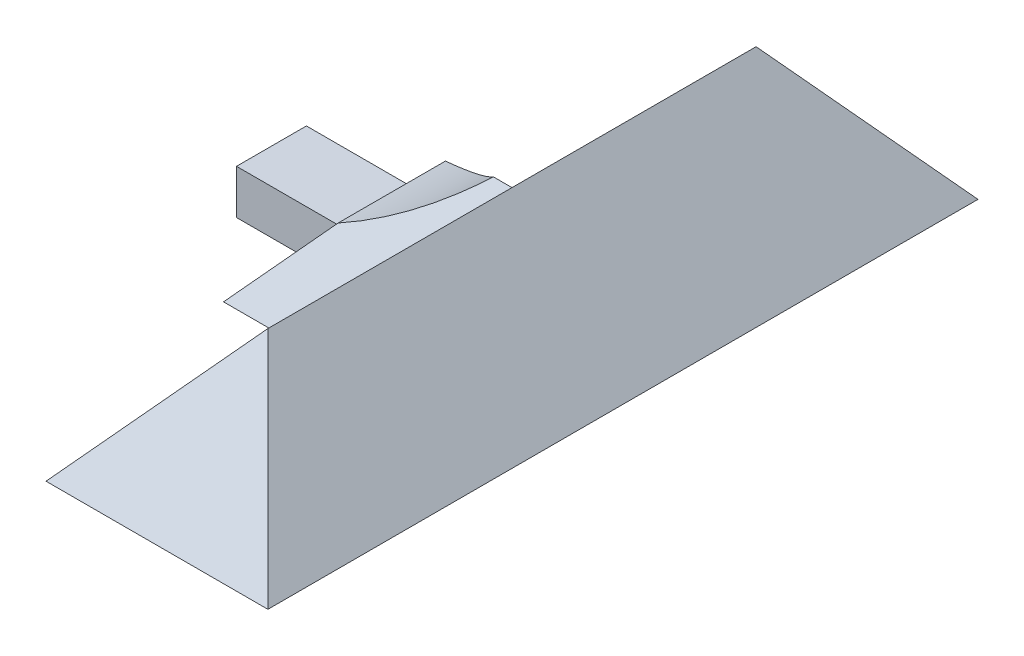
ISO-10303-21;
HEADER;
FILE_DESCRIPTION(('STEP AP214'),'2;1');
FILE_NAME('part.step','',(''),(''),'','','');
FILE_SCHEMA(('AUTOMOTIVE_DESIGN { 1 0 10303 214 1 1 1 1 }'));
ENDSEC;
DATA;
#1=APPLICATION_CONTEXT('core data for automotive mechanical design processes');
#2=APPLICATION_PROTOCOL_DEFINITION('international standard','automotive_design',2000,#1);
#3=PRODUCT_CONTEXT('',#1,'mechanical');
#4=PRODUCT('Part','Part','',(#3));
#5=PRODUCT_RELATED_PRODUCT_CATEGORY('part','',(#4));
#6=PRODUCT_DEFINITION_FORMATION('','',#4);
#7=PRODUCT_DEFINITION_CONTEXT('part definition',#1,'design');
#8=PRODUCT_DEFINITION('design','',#6,#7);
#9=PRODUCT_DEFINITION_SHAPE('','',#8);
#10=(LENGTH_UNIT() NAMED_UNIT(*) SI_UNIT(.MILLI.,.METRE.));
#11=(NAMED_UNIT(*) PLANE_ANGLE_UNIT() SI_UNIT($,.RADIAN.));
#12=(NAMED_UNIT(*) SI_UNIT($,.STERADIAN.) SOLID_ANGLE_UNIT());
#13=UNCERTAINTY_MEASURE_WITH_UNIT(LENGTH_MEASURE(1.E-05),#10,'distance_accuracy_value','');
#14=(GEOMETRIC_REPRESENTATION_CONTEXT(3) GLOBAL_UNCERTAINTY_ASSIGNED_CONTEXT((#13)) GLOBAL_UNIT_ASSIGNED_CONTEXT((#10,
#11,#12)) REPRESENTATION_CONTEXT('',''));
#15=CARTESIAN_POINT('',(0.,0.,0.));
#16=DIRECTION('',(0.,0.,1.));
#17=DIRECTION('',(1.,0.,0.));
#18=AXIS2_PLACEMENT_3D('',#15,#16,#17);
#19=CARTESIAN_POINT('',(0.,0.,0.));
#20=DIRECTION('',(-0.766044443118977,0.64278760968654,0.));
#21=DIRECTION('',(-0.64278760968654,-0.766044443118977,0.));
#22=AXIS2_PLACEMENT_3D('',#19,#20,#21);
#23=PLANE('',#22);
#24=DIRECTION('',(-0.540716203060937,-0.644400477571771,0.540716203060937));
#25=VECTOR('',#24,1.);
#26=CARTESIAN_POINT('',(0.,0.,0.));
#27=LINE('',#26,#25);
#28=CARTESIAN_POINT('',(12.9059879585052,15.3807575155261,-12.9059879585052));
#29=VERTEX_POINT('',#28);
#30=CARTESIAN_POINT('',(0.,0.,0.));
#31=VERTEX_POINT('',#30);
#32=EDGE_CURVE('E132',#29,#31,#27,.T.);
#33=ORIENTED_EDGE('',*,*,#32,.F.);
#34=DIRECTION('',(0.,0.,1.));
#35=VECTOR('',#34,1.);
#36=CARTESIAN_POINT('',(12.9059879585052,15.3807575155261,-80.));
#37=LINE('',#36,#35);
#38=CARTESIAN_POINT('',(12.9059879585052,15.3807575155261,-37.0940120414948));
#39=VERTEX_POINT('',#38);
#40=EDGE_CURVE('E122',#29,#39,#37,.F.);
#41=ORIENTED_EDGE('',*,*,#40,.T.);
#42=DIRECTION('',(-0.540716203060937,-0.644400477571771,-0.540716203060937));
#43=VECTOR('',#42,1.);
#44=CARTESIAN_POINT('',(14.6187006126319,17.4218889741631,-35.3812993873682));
#45=LINE('',#44,#43);
#46=CARTESIAN_POINT('',(0.,0.,-50.));
#47=VERTEX_POINT('',#46);
#48=EDGE_CURVE('E129',#39,#47,#45,.T.);
#49=ORIENTED_EDGE('',*,*,#48,.T.);
#50=DIRECTION('',(0.,0.,1.));
#51=VECTOR('',#50,1.);
#52=CARTESIAN_POINT('',(0.,0.,0.));
#53=LINE('',#52,#51);
#54=CARTESIAN_POINT('',(0.,0.,-33.6627220848084));
#55=VERTEX_POINT('',#54);
#56=EDGE_CURVE('E203',#47,#55,#53,.T.);
#57=ORIENTED_EDGE('',*,*,#56,.T.);
#58=DIRECTION('',(-0.64278760968654,-0.766044443118977,0.));
#59=VECTOR('',#58,1.);
#60=CARTESIAN_POINT('',(0.,0.,-33.6627220848084));
#61=LINE('',#60,#59);
#62=CARTESIAN_POINT('',(8.39099631177282,10.,-33.6627220848084));
#63=VERTEX_POINT('',#62);
#64=EDGE_CURVE('E63',#55,#63,#61,.F.);
#65=ORIENTED_EDGE('',*,*,#64,.T.);
#66=DIRECTION('',(0.,0.,1.));
#67=VECTOR('',#66,1.);
#68=CARTESIAN_POINT('',(8.39099631177282,10.,0.));
#69=LINE('',#68,#67);
#70=CARTESIAN_POINT('',(8.39099631177282,10.,-17.9123182942475));
#71=VERTEX_POINT('',#70);
#72=EDGE_CURVE('E11',#71,#63,#69,.F.);
#73=ORIENTED_EDGE('',*,*,#72,.F.);
#74=DIRECTION('',(0.64278760968654,0.766044443118977,0.));
#75=VECTOR('',#74,1.);
#76=CARTESIAN_POINT('',(0.,0.,-17.9123182942475));
#77=LINE('',#76,#75);
#78=CARTESIAN_POINT('',(0.,0.,-17.9123182942475));
#79=VERTEX_POINT('',#78);
#80=EDGE_CURVE('E214',#71,#79,#77,.F.);
#81=ORIENTED_EDGE('',*,*,#80,.T.);
#82=EDGE_CURVE('E208',#79,#31,#53,.T.);
#83=ORIENTED_EDGE('',*,*,#82,.T.);
#84=EDGE_LOOP('',(#33,#41,#49,#57,#65,#73,#81,#83));
#85=FACE_BOUND('',#84,.T.);
#86=ADVANCED_FACE('F39',(#85),#23,.T.);
#87=CARTESIAN_POINT('',(0.,0.,0.));
#88=DIRECTION('',(0.,0.64278760968654,0.766044443118977));
#89=DIRECTION('',(0.,-0.766044443118977,0.64278760968654));
#90=AXIS2_PLACEMENT_3D('',#87,#88,#89);
#91=PLANE('',#90);
#92=DIRECTION('',(1.,0.,0.));
#93=VECTOR('',#92,1.);
#94=CARTESIAN_POINT('',(0.,29.7938398148552,-25.));
#95=LINE('',#94,#93);
#96=CARTESIAN_POINT('',(35.7773664776606,29.7938398148552,-25.));
#97=VERTEX_POINT('',#96);
#98=CARTESIAN_POINT('',(40.,29.7938398148552,-25.));
#99=VERTEX_POINT('',#98);
#100=EDGE_CURVE('E48',#97,#99,#95,.T.);
#101=ORIENTED_EDGE('',*,*,#100,.F.);
#102=CARTESIAN_POINT('',(-14.9895506792058,85.,-71.323468650069));
#103=DIRECTION('',(0.,0.64278760968654,0.766044443118977));
#104=DIRECTION('',(0.,-0.766044443118977,0.64278760968654));
#105=AXIS2_PLACEMENT_3D('',#102,#103,#104);
#106=ELLIPSE('',#105,97.905546699921,75.);
#107=EDGE_CURVE('E55',#97,#29,#106,.F.);
#108=ORIENTED_EDGE('',*,*,#107,.T.);
#109=ORIENTED_EDGE('',*,*,#32,.T.);
#110=DIRECTION('',(1.,0.,0.));
#111=VECTOR('',#110,1.);
#112=CARTESIAN_POINT('',(0.,0.,0.));
#113=LINE('',#112,#111);
#114=CARTESIAN_POINT('',(15.,0.,0.));
#115=VERTEX_POINT('',#114);
#116=EDGE_CURVE('E192',#31,#115,#113,.T.);
#117=ORIENTED_EDGE('',*,*,#116,.T.);
#118=DIRECTION('',(-0.540716203060937,-0.644400477571771,0.540716203060937));
#119=VECTOR('',#118,1.);
#120=CARTESIAN_POINT('',(10.6143898162105,-5.22656669224895,4.38561018378957));
#121=LINE('',#120,#119);
#122=EDGE_CURVE('E164',#99,#115,#121,.T.);
#123=ORIENTED_EDGE('',*,*,#122,.F.);
#124=EDGE_LOOP('',(#101,#108,#109,#117,#123));
#125=FACE_BOUND('',#124,.T.);
#126=ADVANCED_FACE('F41',(#125),#91,.T.);
#127=CARTESIAN_POINT('',(15.,0.,0.));
#128=DIRECTION('',(-0.766044443118977,0.64278760968654,0.));
#129=DIRECTION('',(-0.64278760968654,-0.766044443118977,0.));
#130=AXIS2_PLACEMENT_3D('',#127,#128,#129);
#131=PLANE('',#130);
#132=DIRECTION('',(-0.540716203060937,-0.644400477571771,0.540716203060937));
#133=VECTOR('',#132,1.);
#134=CARTESIAN_POINT('',(29.6187006126319,17.4218889741631,40.3812993873682));
#135=LINE('',#134,#133);
#136=CARTESIAN_POINT('',(40.,29.7938398148552,30.));
#137=VERTEX_POINT('',#136);
#138=CARTESIAN_POINT('',(15.,0.,55.));
#139=VERTEX_POINT('',#138);
#140=EDGE_CURVE('E161',#137,#139,#135,.T.);
#141=ORIENTED_EDGE('',*,*,#140,.F.);
#142=DIRECTION('',(0.,0.,-1.));
#143=VECTOR('',#142,1.);
#144=CARTESIAN_POINT('',(40.,29.7938398148552,0.));
#145=LINE('',#144,#143);
#146=EDGE_CURVE('E167',#137,#99,#145,.T.);
#147=ORIENTED_EDGE('',*,*,#146,.T.);
#148=ORIENTED_EDGE('',*,*,#122,.T.);
#149=DIRECTION('',(0.,0.,1.));
#150=VECTOR('',#149,1.);
#151=CARTESIAN_POINT('',(15.,0.,0.));
#152=LINE('',#151,#150);
#153=EDGE_CURVE('E212',#115,#139,#152,.T.);
#154=ORIENTED_EDGE('',*,*,#153,.T.);
#155=EDGE_LOOP('',(#141,#147,#148,#154));
#156=FACE_BOUND('',#155,.T.);
#157=ADVANCED_FACE('F187',(#156),#131,.T.);
#158=CARTESIAN_POINT('',(65.,0.,55.));
#159=DIRECTION('',(0.,0.64278760968654,0.766044443118977));
#160=DIRECTION('',(0.,-0.766044443118977,0.64278760968654));
#161=AXIS2_PLACEMENT_3D('',#158,#159,#160);
#162=PLANE('',#161);
#163=DIRECTION('',(1.,0.,0.));
#164=VECTOR('',#163,1.);
#165=CARTESIAN_POINT('',(65.,0.,55.));
#166=LINE('',#165,#164);
#167=CARTESIAN_POINT('',(65.,0.,55.));
#168=VERTEX_POINT('',#167);
#169=EDGE_CURVE('E220',#139,#168,#166,.T.);
#170=ORIENTED_EDGE('',*,*,#169,.T.);
#171=DIRECTION('',(0.540716203060938,-0.644400477571771,0.540716203060937));
#172=VECTOR('',#171,1.);
#173=CARTESIAN_POINT('',(18.2201580395781,55.750044717322,8.2201580395781));
#174=LINE('',#173,#172);
#175=EDGE_CURVE('E157',#137,#168,#174,.T.);
#176=ORIENTED_EDGE('',*,*,#175,.F.);
#177=ORIENTED_EDGE('',*,*,#140,.T.);
#178=EDGE_LOOP('',(#170,#176,#177));
#179=FACE_BOUND('',#178,.T.);
#180=ADVANCED_FACE('F232',(#179),#162,.T.);
#181=CARTESIAN_POINT('',(65.,0.,-105.));
#182=DIRECTION('',(0.766044443118977,0.64278760968654,0.));
#183=DIRECTION('',(-0.64278760968654,0.766044443118977,0.));
#184=AXIS2_PLACEMENT_3D('',#181,#182,#183);
#185=PLANE('',#184);
#186=DIRECTION('',(0.540716203060937,-0.644400477571771,-0.540716203060937));
#187=VECTOR('',#186,1.);
#188=CARTESIAN_POINT('',(65.,0.,-105.));
#189=LINE('',#188,#187);
#190=CARTESIAN_POINT('',(40.,29.7938398148552,-80.));
#191=VERTEX_POINT('',#190);
#192=CARTESIAN_POINT('',(65.,0.,-105.));
#193=VERTEX_POINT('',#192);
#194=EDGE_CURVE('E154',#191,#193,#189,.T.);
#195=ORIENTED_EDGE('',*,*,#194,.F.);
#196=DIRECTION('',(0.,0.,1.));
#197=VECTOR('',#196,1.);
#198=CARTESIAN_POINT('',(40.,29.7938398148552,-105.));
#199=LINE('',#198,#197);
#200=EDGE_CURVE('E171',#191,#99,#199,.T.);
#201=ORIENTED_EDGE('',*,*,#200,.T.);
#202=ORIENTED_EDGE('',*,*,#146,.F.);
#203=ORIENTED_EDGE('',*,*,#175,.T.);
#204=DIRECTION('',(0.,0.,-1.));
#205=VECTOR('',#204,1.);
#206=CARTESIAN_POINT('',(65.,0.,-105.));
#207=LINE('',#206,#205);
#208=EDGE_CURVE('E223',#168,#193,#207,.T.);
#209=ORIENTED_EDGE('',*,*,#208,.T.);
#210=EDGE_LOOP('',(#195,#201,#202,#203,#209));
#211=FACE_BOUND('',#210,.T.);
#212=ADVANCED_FACE('F181',(#211),#185,.T.);
#213=CARTESIAN_POINT('',(65.,0.,-105.));
#214=DIRECTION('',(0.,0.64278760968654,-0.766044443118977));
#215=DIRECTION('',(0.,0.766044443118977,0.64278760968654));
#216=AXIS2_PLACEMENT_3D('',#213,#214,#215);
#217=PLANE('',#216);
#218=DIRECTION('',(-1.,0.,0.));
#219=VECTOR('',#218,1.);
#220=CARTESIAN_POINT('',(65.,0.,-105.));
#221=LINE('',#220,#219);
#222=CARTESIAN_POINT('',(15.,0.,-105.));
#223=VERTEX_POINT('',#222);
#224=EDGE_CURVE('E199',#193,#223,#221,.T.);
#225=ORIENTED_EDGE('',*,*,#224,.T.);
#226=DIRECTION('',(-0.540716203060937,-0.644400477571771,-0.540716203060937));
#227=VECTOR('',#226,1.);
#228=CARTESIAN_POINT('',(15.,0.,-105.));
#229=LINE('',#228,#227);
#230=EDGE_CURVE('E145',#191,#223,#229,.T.);
#231=ORIENTED_EDGE('',*,*,#230,.F.);
#232=ORIENTED_EDGE('',*,*,#194,.T.);
#233=EDGE_LOOP('',(#225,#231,#232));
#234=FACE_BOUND('',#233,.T.);
#235=ADVANCED_FACE('F228',(#234),#217,.T.);
#236=CARTESIAN_POINT('',(15.,0.,-105.));
#237=DIRECTION('',(-0.766044443118977,0.64278760968654,0.));
#238=DIRECTION('',(-0.64278760968654,-0.766044443118977,0.));
#239=AXIS2_PLACEMENT_3D('',#236,#237,#238);
#240=PLANE('',#239);
#241=ORIENTED_EDGE('',*,*,#200,.F.);
#242=ORIENTED_EDGE('',*,*,#230,.T.);
#243=DIRECTION('',(0.,0.,1.));
#244=VECTOR('',#243,1.);
#245=CARTESIAN_POINT('',(15.,0.,-105.));
#246=LINE('',#245,#244);
#247=CARTESIAN_POINT('',(15.,0.,-50.));
#248=VERTEX_POINT('',#247);
#249=EDGE_CURVE('E147',#223,#248,#246,.T.);
#250=ORIENTED_EDGE('',*,*,#249,.T.);
#251=DIRECTION('',(-0.540716203060937,-0.644400477571771,-0.540716203060937));
#252=VECTOR('',#251,1.);
#253=CARTESIAN_POINT('',(-1.08057067389501,-19.1640778715794,-66.080570673895));
#254=LINE('',#253,#252);
#255=EDGE_CURVE('E141',#99,#248,#254,.T.);
#256=ORIENTED_EDGE('',*,*,#255,.F.);
#257=EDGE_LOOP('',(#241,#242,#250,#256));
#258=FACE_BOUND('',#257,.T.);
#259=ADVANCED_FACE('F194',(#258),#240,.T.);
#260=CARTESIAN_POINT('',(0.,0.,-50.));
#261=DIRECTION('',(0.,0.64278760968654,-0.766044443118977));
#262=DIRECTION('',(0.,0.766044443118977,0.64278760968654));
#263=AXIS2_PLACEMENT_3D('',#260,#261,#262);
#264=PLANE('',#263);
#265=ORIENTED_EDGE('',*,*,#48,.F.);
#266=CARTESIAN_POINT('',(-14.9895506792058,85.,21.323468650069));
#267=DIRECTION('',(0.,0.64278760968654,-0.766044443118977));
#268=DIRECTION('',(0.,0.766044443118977,0.64278760968654));
#269=AXIS2_PLACEMENT_3D('',#266,#267,#268);
#270=ELLIPSE('',#269,97.905546699921,75.);
#271=EDGE_CURVE('E119',#39,#97,#270,.F.);
#272=ORIENTED_EDGE('',*,*,#271,.T.);
#273=ORIENTED_EDGE('',*,*,#100,.T.);
#274=ORIENTED_EDGE('',*,*,#255,.T.);
#275=DIRECTION('',(-1.,0.,0.));
#276=VECTOR('',#275,1.);
#277=CARTESIAN_POINT('',(0.,0.,-50.));
#278=LINE('',#277,#276);
#279=EDGE_CURVE('E138',#248,#47,#278,.T.);
#280=ORIENTED_EDGE('',*,*,#279,.T.);
#281=EDGE_LOOP('',(#265,#272,#273,#274,#280));
#282=FACE_BOUND('',#281,.T.);
#283=ADVANCED_FACE('F136',(#282),#264,.T.);
#284=CARTESIAN_POINT('',(0.,0.,0.));
#285=DIRECTION('',(0.,-1.,0.));
#286=DIRECTION('',(0.,0.,-1.));
#287=AXIS2_PLACEMENT_3D('',#284,#285,#286);
#288=PLANE('',#287);
#289=ORIENTED_EDGE('',*,*,#82,.F.);
#290=DIRECTION('',(-1.,0.,0.));
#291=VECTOR('',#290,1.);
#292=CARTESIAN_POINT('',(-14.9895506792058,0.,-17.9123182942475));
#293=LINE('',#292,#291);
#294=CARTESIAN_POINT('',(-14.9895506792058,0.,-17.9123182942475));
#295=VERTEX_POINT('',#294);
#296=EDGE_CURVE('E235',#79,#295,#293,.T.);
#297=ORIENTED_EDGE('',*,*,#296,.T.);
#298=DIRECTION('',(0.,0.,-1.));
#299=VECTOR('',#298,1.);
#300=CARTESIAN_POINT('',(-14.9895506792058,0.,-17.9123182942475));
#301=LINE('',#300,#299);
#302=CARTESIAN_POINT('',(-14.9895506792058,0.,-33.6627220848084));
#303=VERTEX_POINT('',#302);
#304=EDGE_CURVE('E134',#295,#303,#301,.T.);
#305=ORIENTED_EDGE('',*,*,#304,.T.);
#306=DIRECTION('',(1.,0.,0.));
#307=VECTOR('',#306,1.);
#308=CARTESIAN_POINT('',(-14.9895506792058,0.,-33.6627220848084));
#309=LINE('',#308,#307);
#310=EDGE_CURVE('E206',#303,#55,#309,.T.);
#311=ORIENTED_EDGE('',*,*,#310,.T.);
#312=ORIENTED_EDGE('',*,*,#56,.F.);
#313=ORIENTED_EDGE('',*,*,#279,.F.);
#314=ORIENTED_EDGE('',*,*,#249,.F.);
#315=ORIENTED_EDGE('',*,*,#224,.F.);
#316=ORIENTED_EDGE('',*,*,#208,.F.);
#317=ORIENTED_EDGE('',*,*,#169,.F.);
#318=ORIENTED_EDGE('',*,*,#153,.F.);
#319=ORIENTED_EDGE('',*,*,#116,.F.);
#320=EDGE_LOOP('',(#289,#297,#305,#311,#312,#313,#314,#315,#316,#317,#318,#319));
#321=FACE_BOUND('',#320,.T.);
#322=ADVANCED_FACE('F201',(#321),#288,.T.);
#323=CARTESIAN_POINT('',(0.,10.,0.));
#324=DIRECTION('',(0.,-1.,0.));
#325=DIRECTION('',(0.,0.,-1.));
#326=AXIS2_PLACEMENT_3D('',#323,#324,#325);
#327=PLANE('',#326);
#328=DIRECTION('',(-1.,0.,0.));
#329=VECTOR('',#328,1.);
#330=CARTESIAN_POINT('',(-14.9895506792058,10.,-17.9123182942475));
#331=LINE('',#330,#329);
#332=CARTESIAN_POINT('',(-14.9895506792058,10.,-17.9123182942475));
#333=VERTEX_POINT('',#332);
#334=EDGE_CURVE('E260',#71,#333,#331,.T.);
#335=ORIENTED_EDGE('',*,*,#334,.F.);
#336=ORIENTED_EDGE('',*,*,#72,.T.);
#337=DIRECTION('',(1.,0.,0.));
#338=VECTOR('',#337,1.);
#339=CARTESIAN_POINT('',(-14.9895506792058,10.,-33.6627220848084));
#340=LINE('',#339,#338);
#341=CARTESIAN_POINT('',(-14.9895506792058,10.,-33.6627220848084));
#342=VERTEX_POINT('',#341);
#343=EDGE_CURVE('E251',#342,#63,#340,.T.);
#344=ORIENTED_EDGE('',*,*,#343,.F.);
#345=DIRECTION('',(0.,0.,-1.));
#346=VECTOR('',#345,1.);
#347=CARTESIAN_POINT('',(-14.9895506792058,10.,-17.9123182942475));
#348=LINE('',#347,#346);
#349=EDGE_CURVE('E246',#333,#342,#348,.T.);
#350=ORIENTED_EDGE('',*,*,#349,.F.);
#351=EDGE_LOOP('',(#335,#336,#344,#350));
#352=FACE_BOUND('',#351,.T.);
#353=ADVANCED_FACE('F281',(#352),#327,.F.);
#354=CARTESIAN_POINT('',(-14.9895506792058,10.,-17.9123182942475));
#355=DIRECTION('',(0.,0.,1.));
#356=DIRECTION('',(1.,0.,0.));
#357=AXIS2_PLACEMENT_3D('',#354,#355,#356);
#358=PLANE('',#357);
#359=ORIENTED_EDGE('',*,*,#80,.F.);
#360=ORIENTED_EDGE('',*,*,#334,.T.);
#361=DIRECTION('',(0.,-1.,0.));
#362=VECTOR('',#361,1.);
#363=CARTESIAN_POINT('',(-14.9895506792058,10.,-17.9123182942475));
#364=LINE('',#363,#362);
#365=EDGE_CURVE('E243',#333,#295,#364,.T.);
#366=ORIENTED_EDGE('',*,*,#365,.T.);
#367=ORIENTED_EDGE('',*,*,#296,.F.);
#368=EDGE_LOOP('',(#359,#360,#366,#367));
#369=FACE_BOUND('',#368,.T.);
#370=ADVANCED_FACE('F241',(#369),#358,.T.);
#371=CARTESIAN_POINT('',(-14.9895506792058,10.,-33.6627220848084));
#372=DIRECTION('',(0.,0.,-1.));
#373=DIRECTION('',(-1.,0.,0.));
#374=AXIS2_PLACEMENT_3D('',#371,#372,#373);
#375=PLANE('',#374);
#376=ORIENTED_EDGE('',*,*,#64,.F.);
#377=ORIENTED_EDGE('',*,*,#310,.F.);
#378=DIRECTION('',(0.,-1.,0.));
#379=VECTOR('',#378,1.);
#380=CARTESIAN_POINT('',(-14.9895506792058,10.,-33.6627220848084));
#381=LINE('',#380,#379);
#382=EDGE_CURVE('E258',#342,#303,#381,.T.);
#383=ORIENTED_EDGE('',*,*,#382,.F.);
#384=ORIENTED_EDGE('',*,*,#343,.T.);
#385=EDGE_LOOP('',(#376,#377,#383,#384));
#386=FACE_BOUND('',#385,.T.);
#387=ADVANCED_FACE('F273',(#386),#375,.T.);
#388=CARTESIAN_POINT('',(-14.9895506792058,10.,-17.9123182942475));
#389=DIRECTION('',(-1.,0.,0.));
#390=DIRECTION('',(0.,0.,1.));
#391=AXIS2_PLACEMENT_3D('',#388,#389,#390);
#392=PLANE('',#391);
#393=ORIENTED_EDGE('',*,*,#304,.F.);
#394=ORIENTED_EDGE('',*,*,#365,.F.);
#395=ORIENTED_EDGE('',*,*,#349,.T.);
#396=ORIENTED_EDGE('',*,*,#382,.T.);
#397=EDGE_LOOP('',(#393,#394,#395,#396));
#398=FACE_BOUND('',#397,.T.);
#399=ADVANCED_FACE('F271',(#398),#392,.T.);
#400=CARTESIAN_POINT('',(-14.9895506792058,85.,-80.));
#401=DIRECTION('',(0.,0.,1.));
#402=DIRECTION('',(1.,0.,0.));
#403=AXIS2_PLACEMENT_3D('',#400,#401,#402);
#404=CYLINDRICAL_SURFACE('',#403,75.);
#405=ORIENTED_EDGE('',*,*,#107,.F.);
#406=ORIENTED_EDGE('',*,*,#271,.F.);
#407=ORIENTED_EDGE('',*,*,#40,.F.);
#408=EDGE_LOOP('',(#405,#406,#407));
#409=FACE_BOUND('',#408,.T.);
#410=ADVANCED_FACE('F121',(#409),#404,.F.);
#411=CLOSED_SHELL('',(#86,#126,#157,#180,#212,#235,#259,#283,#322,#353,#370,#387,#399,#410));
#412=MANIFOLD_SOLID_BREP('B2',#411);
#413=ADVANCED_BREP_SHAPE_REPRESENTATION('',(#18,#412),#14);
#414=SHAPE_DEFINITION_REPRESENTATION(#9,#413);
ENDSEC;
END-ISO-10303-21;
